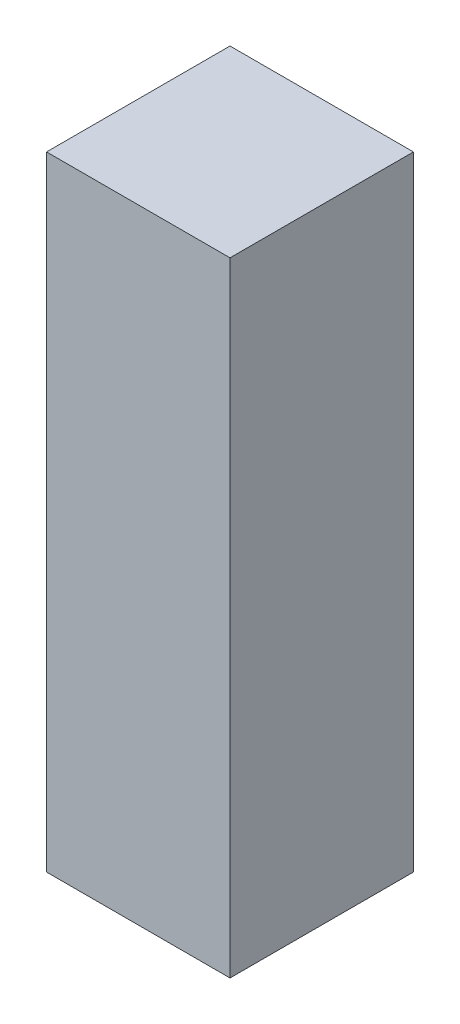
ISO-10303-21;
HEADER;
FILE_DESCRIPTION(('STEP AP214'),'2;1');
FILE_NAME('part.step','',(''),(''),'','','');
FILE_SCHEMA(('AUTOMOTIVE_DESIGN { 1 0 10303 214 1 1 1 1 }'));
ENDSEC;
DATA;
#1=APPLICATION_CONTEXT('core data for automotive mechanical design processes');
#2=APPLICATION_PROTOCOL_DEFINITION('international standard','automotive_design',2000,#1);
#3=PRODUCT_CONTEXT('',#1,'mechanical');
#4=PRODUCT('Part','Part','',(#3));
#5=PRODUCT_RELATED_PRODUCT_CATEGORY('part','',(#4));
#6=PRODUCT_DEFINITION_FORMATION('','',#4);
#7=PRODUCT_DEFINITION_CONTEXT('part definition',#1,'design');
#8=PRODUCT_DEFINITION('design','',#6,#7);
#9=PRODUCT_DEFINITION_SHAPE('','',#8);
#10=(LENGTH_UNIT() NAMED_UNIT(*) SI_UNIT(.MILLI.,.METRE.));
#11=(NAMED_UNIT(*) PLANE_ANGLE_UNIT() SI_UNIT($,.RADIAN.));
#12=(NAMED_UNIT(*) SI_UNIT($,.STERADIAN.) SOLID_ANGLE_UNIT());
#13=UNCERTAINTY_MEASURE_WITH_UNIT(LENGTH_MEASURE(1.E-05),#10,'distance_accuracy_value','');
#14=(GEOMETRIC_REPRESENTATION_CONTEXT(3) GLOBAL_UNCERTAINTY_ASSIGNED_CONTEXT((#13)) GLOBAL_UNIT_ASSIGNED_CONTEXT((#10,
#11,#12)) REPRESENTATION_CONTEXT('',''));
#15=CARTESIAN_POINT('',(0.,0.,0.));
#16=DIRECTION('',(0.,0.,1.));
#17=DIRECTION('',(1.,0.,0.));
#18=AXIS2_PLACEMENT_3D('',#15,#16,#17);
#19=CARTESIAN_POINT('',(2.5,8.5,2.5));
#20=DIRECTION('',(-1.,0.,0.));
#21=DIRECTION('',(0.,0.,1.));
#22=AXIS2_PLACEMENT_3D('',#19,#20,#21);
#23=PLANE('',#22);
#24=DIRECTION('',(0.,0.,-1.));
#25=VECTOR('',#24,1.);
#26=CARTESIAN_POINT('',(2.5,-8.5,2.5));
#27=LINE('',#26,#25);
#28=CARTESIAN_POINT('',(2.5,-8.5,2.5));
#29=VERTEX_POINT('',#28);
#30=CARTESIAN_POINT('',(2.5,-8.5,-2.5));
#31=VERTEX_POINT('',#30);
#32=EDGE_CURVE('E98',#29,#31,#27,.T.);
#33=ORIENTED_EDGE('',*,*,#32,.T.);
#34=DIRECTION('',(0.,-1.,0.));
#35=VECTOR('',#34,1.);
#36=CARTESIAN_POINT('',(2.5,8.5,-2.5));
#37=LINE('',#36,#35);
#38=CARTESIAN_POINT('',(2.5,8.5,-2.5));
#39=VERTEX_POINT('',#38);
#40=EDGE_CURVE('E11',#39,#31,#37,.T.);
#41=ORIENTED_EDGE('',*,*,#40,.F.);
#42=DIRECTION('',(0.,0.,-1.));
#43=VECTOR('',#42,1.);
#44=CARTESIAN_POINT('',(2.5,8.5,2.5));
#45=LINE('',#44,#43);
#46=CARTESIAN_POINT('',(2.5,8.5,2.5));
#47=VERTEX_POINT('',#46);
#48=EDGE_CURVE('E86',#47,#39,#45,.T.);
#49=ORIENTED_EDGE('',*,*,#48,.F.);
#50=DIRECTION('',(0.,-1.,0.));
#51=VECTOR('',#50,1.);
#52=CARTESIAN_POINT('',(2.5,8.5,2.5));
#53=LINE('',#52,#51);
#54=EDGE_CURVE('E94',#47,#29,#53,.T.);
#55=ORIENTED_EDGE('',*,*,#54,.T.);
#56=EDGE_LOOP('',(#33,#41,#49,#55));
#57=FACE_BOUND('',#56,.T.);
#58=ADVANCED_FACE('F35',(#57),#23,.F.);
#59=CARTESIAN_POINT('',(-2.5,8.5,-2.5));
#60=DIRECTION('',(0.,0.,1.));
#61=DIRECTION('',(1.,0.,0.));
#62=AXIS2_PLACEMENT_3D('',#59,#60,#61);
#63=PLANE('',#62);
#64=DIRECTION('',(-1.,0.,0.));
#65=VECTOR('',#64,1.);
#66=CARTESIAN_POINT('',(-2.5,-8.5,-2.5));
#67=LINE('',#66,#65);
#68=CARTESIAN_POINT('',(-2.5,-8.5,-2.5));
#69=VERTEX_POINT('',#68);
#70=EDGE_CURVE('E90',#31,#69,#67,.T.);
#71=ORIENTED_EDGE('',*,*,#70,.T.);
#72=DIRECTION('',(0.,-1.,0.));
#73=VECTOR('',#72,1.);
#74=CARTESIAN_POINT('',(-2.5,8.5,-2.5));
#75=LINE('',#74,#73);
#76=CARTESIAN_POINT('',(-2.5,8.5,-2.5));
#77=VERTEX_POINT('',#76);
#78=EDGE_CURVE('E43',#77,#69,#75,.T.);
#79=ORIENTED_EDGE('',*,*,#78,.F.);
#80=DIRECTION('',(-1.,0.,0.));
#81=VECTOR('',#80,1.);
#82=CARTESIAN_POINT('',(-2.5,8.5,-2.5));
#83=LINE('',#82,#81);
#84=EDGE_CURVE('E81',#39,#77,#83,.T.);
#85=ORIENTED_EDGE('',*,*,#84,.F.);
#86=ORIENTED_EDGE('',*,*,#40,.T.);
#87=EDGE_LOOP('',(#71,#79,#85,#86));
#88=FACE_BOUND('',#87,.T.);
#89=ADVANCED_FACE('F89',(#88),#63,.F.);
#90=CARTESIAN_POINT('',(-2.5,8.5,2.5));
#91=DIRECTION('',(1.,0.,0.));
#92=DIRECTION('',(0.,0.,-1.));
#93=AXIS2_PLACEMENT_3D('',#90,#91,#92);
#94=PLANE('',#93);
#95=DIRECTION('',(0.,0.,1.));
#96=VECTOR('',#95,1.);
#97=CARTESIAN_POINT('',(-2.5,-8.5,2.5));
#98=LINE('',#97,#96);
#99=CARTESIAN_POINT('',(-2.5,-8.5,2.5));
#100=VERTEX_POINT('',#99);
#101=EDGE_CURVE('E68',#69,#100,#98,.T.);
#102=ORIENTED_EDGE('',*,*,#101,.T.);
#103=DIRECTION('',(0.,-1.,0.));
#104=VECTOR('',#103,1.);
#105=CARTESIAN_POINT('',(-2.5,8.5,2.5));
#106=LINE('',#105,#104);
#107=CARTESIAN_POINT('',(-2.5,8.5,2.5));
#108=VERTEX_POINT('',#107);
#109=EDGE_CURVE('E91',#108,#100,#106,.T.);
#110=ORIENTED_EDGE('',*,*,#109,.F.);
#111=DIRECTION('',(0.,0.,1.));
#112=VECTOR('',#111,1.);
#113=CARTESIAN_POINT('',(-2.5,8.5,2.5));
#114=LINE('',#113,#112);
#115=EDGE_CURVE('E84',#77,#108,#114,.T.);
#116=ORIENTED_EDGE('',*,*,#115,.F.);
#117=ORIENTED_EDGE('',*,*,#78,.T.);
#118=EDGE_LOOP('',(#102,#110,#116,#117));
#119=FACE_BOUND('',#118,.T.);
#120=ADVANCED_FACE('F92',(#119),#94,.F.);
#121=CARTESIAN_POINT('',(-2.5,8.5,2.5));
#122=DIRECTION('',(0.,0.,-1.));
#123=DIRECTION('',(-1.,0.,0.));
#124=AXIS2_PLACEMENT_3D('',#121,#122,#123);
#125=PLANE('',#124);
#126=DIRECTION('',(1.,0.,0.));
#127=VECTOR('',#126,1.);
#128=CARTESIAN_POINT('',(-2.5,-8.5,2.5));
#129=LINE('',#128,#127);
#130=EDGE_CURVE('E74',#100,#29,#129,.T.);
#131=ORIENTED_EDGE('',*,*,#130,.T.);
#132=ORIENTED_EDGE('',*,*,#54,.F.);
#133=DIRECTION('',(1.,0.,0.));
#134=VECTOR('',#133,1.);
#135=CARTESIAN_POINT('',(-2.5,8.5,2.5));
#136=LINE('',#135,#134);
#137=EDGE_CURVE('E51',#108,#47,#136,.T.);
#138=ORIENTED_EDGE('',*,*,#137,.F.);
#139=ORIENTED_EDGE('',*,*,#109,.T.);
#140=EDGE_LOOP('',(#131,#132,#138,#139));
#141=FACE_BOUND('',#140,.T.);
#142=ADVANCED_FACE('F105',(#141),#125,.F.);
#143=CARTESIAN_POINT('',(0.,8.5,0.));
#144=DIRECTION('',(0.,-1.,0.));
#145=DIRECTION('',(0.,0.,-1.));
#146=AXIS2_PLACEMENT_3D('',#143,#144,#145);
#147=PLANE('',#146);
#148=ORIENTED_EDGE('',*,*,#48,.T.);
#149=ORIENTED_EDGE('',*,*,#84,.T.);
#150=ORIENTED_EDGE('',*,*,#115,.T.);
#151=ORIENTED_EDGE('',*,*,#137,.T.);
#152=EDGE_LOOP('',(#148,#149,#150,#151));
#153=FACE_BOUND('',#152,.T.);
#154=ADVANCED_FACE('F82',(#153),#147,.F.);
#155=CARTESIAN_POINT('',(0.,-8.5,0.));
#156=DIRECTION('',(0.,-1.,0.));
#157=DIRECTION('',(0.,0.,-1.));
#158=AXIS2_PLACEMENT_3D('',#155,#156,#157);
#159=PLANE('',#158);
#160=ORIENTED_EDGE('',*,*,#32,.F.);
#161=ORIENTED_EDGE('',*,*,#130,.F.);
#162=ORIENTED_EDGE('',*,*,#101,.F.);
#163=ORIENTED_EDGE('',*,*,#70,.F.);
#164=EDGE_LOOP('',(#160,#161,#162,#163));
#165=FACE_BOUND('',#164,.T.);
#166=ADVANCED_FACE('F108',(#165),#159,.T.);
#167=CLOSED_SHELL('',(#58,#89,#120,#142,#154,#166));
#168=MANIFOLD_SOLID_BREP('B2',#167);
#169=ADVANCED_BREP_SHAPE_REPRESENTATION('',(#18,#168),#14);
#170=SHAPE_DEFINITION_REPRESENTATION(#9,#169);
ENDSEC;
END-ISO-10303-21;
